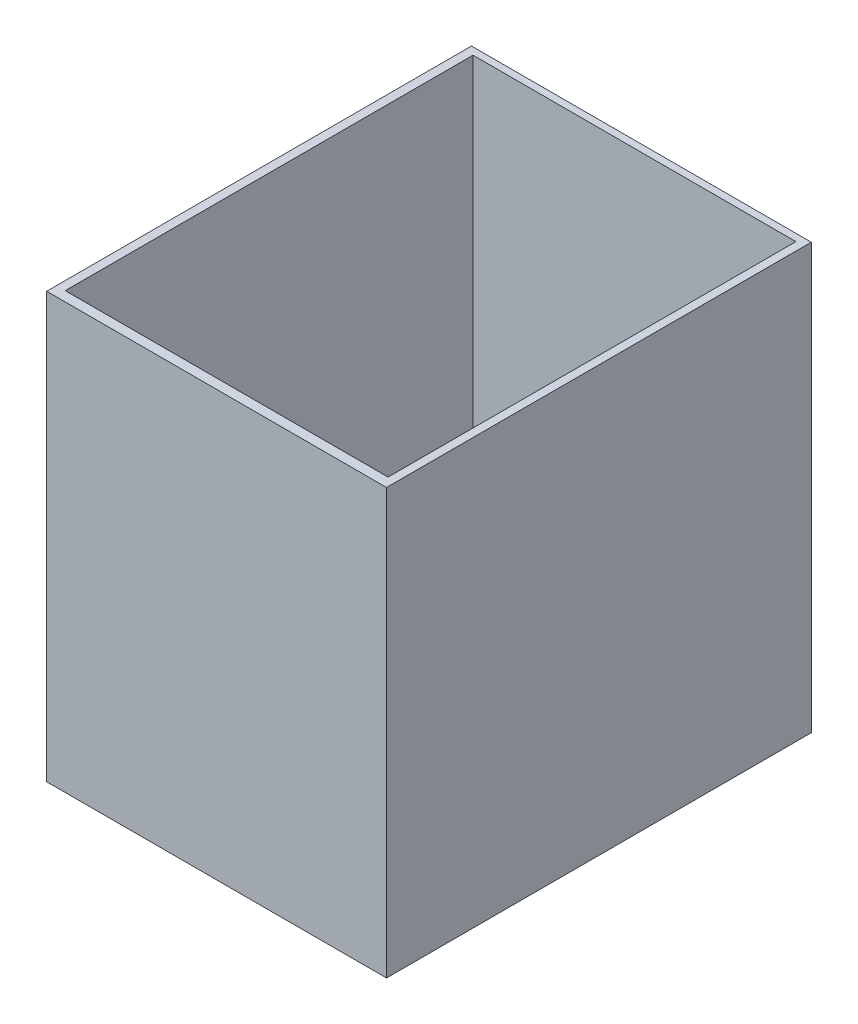
ISO-10303-21;
HEADER;
FILE_DESCRIPTION(('STEP AP214'),'2;1');
FILE_NAME('part.step','',(''),(''),'','','');
FILE_SCHEMA(('AUTOMOTIVE_DESIGN { 1 0 10303 214 1 1 1 1 }'));
ENDSEC;
DATA;
#1=APPLICATION_CONTEXT('core data for automotive mechanical design processes');
#2=APPLICATION_PROTOCOL_DEFINITION('international standard','automotive_design',2000,#1);
#3=PRODUCT_CONTEXT('',#1,'mechanical');
#4=PRODUCT('Part','Part','',(#3));
#5=PRODUCT_RELATED_PRODUCT_CATEGORY('part','',(#4));
#6=PRODUCT_DEFINITION_FORMATION('','',#4);
#7=PRODUCT_DEFINITION_CONTEXT('part definition',#1,'design');
#8=PRODUCT_DEFINITION('design','',#6,#7);
#9=PRODUCT_DEFINITION_SHAPE('','',#8);
#10=(LENGTH_UNIT() NAMED_UNIT(*) SI_UNIT(.MILLI.,.METRE.));
#11=(NAMED_UNIT(*) PLANE_ANGLE_UNIT() SI_UNIT($,.RADIAN.));
#12=(NAMED_UNIT(*) SI_UNIT($,.STERADIAN.) SOLID_ANGLE_UNIT());
#13=UNCERTAINTY_MEASURE_WITH_UNIT(LENGTH_MEASURE(1.E-05),#10,'distance_accuracy_value','');
#14=(GEOMETRIC_REPRESENTATION_CONTEXT(3) GLOBAL_UNCERTAINTY_ASSIGNED_CONTEXT((#13)) GLOBAL_UNIT_ASSIGNED_CONTEXT((#10,
#11,#12)) REPRESENTATION_CONTEXT('',''));
#15=CARTESIAN_POINT('',(0.,0.,0.));
#16=DIRECTION('',(0.,0.,1.));
#17=DIRECTION('',(1.,0.,0.));
#18=AXIS2_PLACEMENT_3D('',#15,#16,#17);
#19=CARTESIAN_POINT('',(-400.,-500.,1000.));
#20=DIRECTION('',(-1.,0.,0.));
#21=DIRECTION('',(0.,0.,1.));
#22=AXIS2_PLACEMENT_3D('',#19,#20,#21);
#23=PLANE('',#22);
#24=DIRECTION('',(0.,1.,0.));
#25=VECTOR('',#24,1.);
#26=CARTESIAN_POINT('',(-400.,-500.,0.));
#27=LINE('',#26,#25);
#28=CARTESIAN_POINT('',(-400.,-500.,0.));
#29=VERTEX_POINT('',#28);
#30=CARTESIAN_POINT('',(-400.,500.,0.));
#31=VERTEX_POINT('',#30);
#32=EDGE_CURVE('E144',#29,#31,#27,.T.);
#33=ORIENTED_EDGE('',*,*,#32,.F.);
#34=DIRECTION('',(0.,0.,-1.));
#35=VECTOR('',#34,1.);
#36=CARTESIAN_POINT('',(-400.,-500.,1000.));
#37=LINE('',#36,#35);
#38=CARTESIAN_POINT('',(-400.,-500.,1000.));
#39=VERTEX_POINT('',#38);
#40=EDGE_CURVE('E11',#39,#29,#37,.T.);
#41=ORIENTED_EDGE('',*,*,#40,.F.);
#42=DIRECTION('',(0.,1.,0.));
#43=VECTOR('',#42,1.);
#44=CARTESIAN_POINT('',(-400.,-500.,1000.));
#45=LINE('',#44,#43);
#46=CARTESIAN_POINT('',(-400.,500.,1000.));
#47=VERTEX_POINT('',#46);
#48=EDGE_CURVE('E146',#39,#47,#45,.T.);
#49=ORIENTED_EDGE('',*,*,#48,.T.);
#50=DIRECTION('',(0.,0.,-1.));
#51=VECTOR('',#50,1.);
#52=CARTESIAN_POINT('',(-400.,500.,1000.));
#53=LINE('',#52,#51);
#54=EDGE_CURVE('E45',#47,#31,#53,.T.);
#55=ORIENTED_EDGE('',*,*,#54,.T.);
#56=EDGE_LOOP('',(#33,#41,#49,#55));
#57=FACE_BOUND('',#56,.T.);
#58=ADVANCED_FACE('F39',(#57),#23,.T.);
#59=CARTESIAN_POINT('',(-400.,-500.,1000.));
#60=DIRECTION('',(0.,1.,0.));
#61=DIRECTION('',(0.,0.,1.));
#62=AXIS2_PLACEMENT_3D('',#59,#60,#61);
#63=PLANE('',#62);
#64=DIRECTION('',(1.,0.,0.));
#65=VECTOR('',#64,1.);
#66=CARTESIAN_POINT('',(-400.,-500.,0.));
#67=LINE('',#66,#65);
#68=CARTESIAN_POINT('',(400.,-500.,0.));
#69=VERTEX_POINT('',#68);
#70=EDGE_CURVE('E155',#29,#69,#67,.T.);
#71=ORIENTED_EDGE('',*,*,#70,.T.);
#72=DIRECTION('',(0.,0.,-1.));
#73=VECTOR('',#72,1.);
#74=CARTESIAN_POINT('',(400.,-500.,1000.));
#75=LINE('',#74,#73);
#76=CARTESIAN_POINT('',(400.,-500.,1000.));
#77=VERTEX_POINT('',#76);
#78=EDGE_CURVE('E50',#77,#69,#75,.T.);
#79=ORIENTED_EDGE('',*,*,#78,.F.);
#80=DIRECTION('',(1.,0.,0.));
#81=VECTOR('',#80,1.);
#82=CARTESIAN_POINT('',(-400.,-500.,1000.));
#83=LINE('',#82,#81);
#84=EDGE_CURVE('E157',#39,#77,#83,.T.);
#85=ORIENTED_EDGE('',*,*,#84,.F.);
#86=ORIENTED_EDGE('',*,*,#40,.T.);
#87=EDGE_LOOP('',(#71,#79,#85,#86));
#88=FACE_BOUND('',#87,.T.);
#89=ADVANCED_FACE('F176',(#88),#63,.F.);
#90=CARTESIAN_POINT('',(400.,-500.,1000.));
#91=DIRECTION('',(-1.,0.,0.));
#92=DIRECTION('',(0.,0.,1.));
#93=AXIS2_PLACEMENT_3D('',#90,#91,#92);
#94=PLANE('',#93);
#95=DIRECTION('',(0.,1.,0.));
#96=VECTOR('',#95,1.);
#97=CARTESIAN_POINT('',(400.,-500.,0.));
#98=LINE('',#97,#96);
#99=CARTESIAN_POINT('',(400.,500.,0.));
#100=VERTEX_POINT('',#99);
#101=EDGE_CURVE('E161',#69,#100,#98,.T.);
#102=ORIENTED_EDGE('',*,*,#101,.T.);
#103=DIRECTION('',(0.,0.,-1.));
#104=VECTOR('',#103,1.);
#105=CARTESIAN_POINT('',(400.,500.,1000.));
#106=LINE('',#105,#104);
#107=CARTESIAN_POINT('',(400.,500.,1000.));
#108=VERTEX_POINT('',#107);
#109=EDGE_CURVE('E166',#108,#100,#106,.T.);
#110=ORIENTED_EDGE('',*,*,#109,.F.);
#111=DIRECTION('',(0.,1.,0.));
#112=VECTOR('',#111,1.);
#113=CARTESIAN_POINT('',(400.,-500.,1000.));
#114=LINE('',#113,#112);
#115=EDGE_CURVE('E152',#77,#108,#114,.T.);
#116=ORIENTED_EDGE('',*,*,#115,.F.);
#117=ORIENTED_EDGE('',*,*,#78,.T.);
#118=EDGE_LOOP('',(#102,#110,#116,#117));
#119=FACE_BOUND('',#118,.T.);
#120=ADVANCED_FACE('F177',(#119),#94,.F.);
#121=CARTESIAN_POINT('',(-400.,500.,1000.));
#122=DIRECTION('',(0.,1.,0.));
#123=DIRECTION('',(0.,0.,1.));
#124=AXIS2_PLACEMENT_3D('',#121,#122,#123);
#125=PLANE('',#124);
#126=DIRECTION('',(0.,0.,1.));
#127=VECTOR('',#126,1.);
#128=CARTESIAN_POINT('',(-379.411649580569,500.,16.9068114060526));
#129=LINE('',#128,#127);
#130=CARTESIAN_POINT('',(-379.411649580569,500.,16.9068114060526));
#131=VERTEX_POINT('',#130);
#132=CARTESIAN_POINT('',(-379.411649580568,500.,976.906811406053));
#133=VERTEX_POINT('',#132);
#134=EDGE_CURVE('E54',#131,#133,#129,.T.);
#135=ORIENTED_EDGE('',*,*,#134,.F.);
#136=DIRECTION('',(-1.,0.,0.));
#137=VECTOR('',#136,1.);
#138=CARTESIAN_POINT('',(-379.411649580569,500.,16.9068114060526));
#139=LINE('',#138,#137);
#140=CARTESIAN_POINT('',(380.588350419431,500.,16.9068114060527));
#141=VERTEX_POINT('',#140);
#142=EDGE_CURVE('E127',#141,#131,#139,.T.);
#143=ORIENTED_EDGE('',*,*,#142,.F.);
#144=DIRECTION('',(0.,0.,-1.));
#145=VECTOR('',#144,1.);
#146=CARTESIAN_POINT('',(380.588350419431,500.,16.9068114060527));
#147=LINE('',#146,#145);
#148=CARTESIAN_POINT('',(380.588350419432,500.,976.906811406053));
#149=VERTEX_POINT('',#148);
#150=EDGE_CURVE('E133',#149,#141,#147,.T.);
#151=ORIENTED_EDGE('',*,*,#150,.F.);
#152=DIRECTION('',(1.,0.,0.));
#153=VECTOR('',#152,1.);
#154=CARTESIAN_POINT('',(-379.411649580568,500.,976.906811406053));
#155=LINE('',#154,#153);
#156=EDGE_CURVE('E137',#133,#149,#155,.T.);
#157=ORIENTED_EDGE('',*,*,#156,.F.);
#158=EDGE_LOOP('',(#135,#143,#151,#157));
#159=FACE_BOUND('',#158,.T.);
#160=DIRECTION('',(1.,0.,0.));
#161=VECTOR('',#160,1.);
#162=CARTESIAN_POINT('',(-400.,500.,0.));
#163=LINE('',#162,#161);
#164=EDGE_CURVE('E158',#31,#100,#163,.T.);
#165=ORIENTED_EDGE('',*,*,#164,.F.);
#166=ORIENTED_EDGE('',*,*,#54,.F.);
#167=DIRECTION('',(1.,0.,0.));
#168=VECTOR('',#167,1.);
#169=CARTESIAN_POINT('',(-400.,500.,1000.));
#170=LINE('',#169,#168);
#171=EDGE_CURVE('E153',#47,#108,#170,.T.);
#172=ORIENTED_EDGE('',*,*,#171,.T.);
#173=ORIENTED_EDGE('',*,*,#109,.T.);
#174=EDGE_LOOP('',(#165,#166,#172,#173));
#175=FACE_BOUND('',#174,.T.);
#176=ADVANCED_FACE('F173',(#159,#175),#125,.T.);
#177=CARTESIAN_POINT('',(0.,0.,1000.));
#178=DIRECTION('',(0.,0.,-1.));
#179=DIRECTION('',(-1.,0.,0.));
#180=AXIS2_PLACEMENT_3D('',#177,#178,#179);
#181=PLANE('',#180);
#182=ORIENTED_EDGE('',*,*,#48,.F.);
#183=ORIENTED_EDGE('',*,*,#84,.T.);
#184=ORIENTED_EDGE('',*,*,#115,.T.);
#185=ORIENTED_EDGE('',*,*,#171,.F.);
#186=EDGE_LOOP('',(#182,#183,#184,#185));
#187=FACE_BOUND('',#186,.T.);
#188=ADVANCED_FACE('F181',(#187),#181,.F.);
#189=CARTESIAN_POINT('',(0.,0.,0.));
#190=DIRECTION('',(0.,0.,-1.));
#191=DIRECTION('',(-1.,0.,0.));
#192=AXIS2_PLACEMENT_3D('',#189,#190,#191);
#193=PLANE('',#192);
#194=ORIENTED_EDGE('',*,*,#32,.T.);
#195=ORIENTED_EDGE('',*,*,#164,.T.);
#196=ORIENTED_EDGE('',*,*,#101,.F.);
#197=ORIENTED_EDGE('',*,*,#70,.F.);
#198=EDGE_LOOP('',(#194,#195,#196,#197));
#199=FACE_BOUND('',#198,.T.);
#200=ADVANCED_FACE('F174',(#199),#193,.T.);
#201=CARTESIAN_POINT('',(-379.411649580569,-460.,16.9068114060526));
#202=DIRECTION('',(-1.,0.,0.));
#203=DIRECTION('',(0.,0.,1.));
#204=AXIS2_PLACEMENT_3D('',#201,#202,#203);
#205=PLANE('',#204);
#206=ORIENTED_EDGE('',*,*,#134,.T.);
#207=DIRECTION('',(0.,1.,0.));
#208=VECTOR('',#207,1.);
#209=CARTESIAN_POINT('',(-379.411649580568,-460.,976.906811406053));
#210=LINE('',#209,#208);
#211=CARTESIAN_POINT('',(-379.411649580568,-460.,976.906811406053));
#212=VERTEX_POINT('',#211);
#213=EDGE_CURVE('E106',#212,#133,#210,.T.);
#214=ORIENTED_EDGE('',*,*,#213,.F.);
#215=DIRECTION('',(0.,0.,1.));
#216=VECTOR('',#215,1.);
#217=CARTESIAN_POINT('',(-379.411649580569,-460.,16.9068114060526));
#218=LINE('',#217,#216);
#219=CARTESIAN_POINT('',(-379.411649580569,-460.,16.9068114060526));
#220=VERTEX_POINT('',#219);
#221=EDGE_CURVE('E115',#220,#212,#218,.T.);
#222=ORIENTED_EDGE('',*,*,#221,.F.);
#223=DIRECTION('',(0.,1.,0.));
#224=VECTOR('',#223,1.);
#225=CARTESIAN_POINT('',(-379.411649580569,-460.,16.9068114060526));
#226=LINE('',#225,#224);
#227=EDGE_CURVE('E142',#220,#131,#226,.T.);
#228=ORIENTED_EDGE('',*,*,#227,.T.);
#229=EDGE_LOOP('',(#206,#214,#222,#228));
#230=FACE_BOUND('',#229,.T.);
#231=ADVANCED_FACE('F109',(#230),#205,.F.);
#232=CARTESIAN_POINT('',(-379.411649580569,-460.,16.9068114060526));
#233=DIRECTION('',(0.,0.,-1.));
#234=DIRECTION('',(-1.,0.,0.));
#235=AXIS2_PLACEMENT_3D('',#232,#233,#234);
#236=PLANE('',#235);
#237=ORIENTED_EDGE('',*,*,#142,.T.);
#238=ORIENTED_EDGE('',*,*,#227,.F.);
#239=DIRECTION('',(-1.,0.,0.));
#240=VECTOR('',#239,1.);
#241=CARTESIAN_POINT('',(-379.411649580569,-460.,16.9068114060526));
#242=LINE('',#241,#240);
#243=CARTESIAN_POINT('',(380.588350419431,-460.,16.9068114060527));
#244=VERTEX_POINT('',#243);
#245=EDGE_CURVE('E116',#244,#220,#242,.T.);
#246=ORIENTED_EDGE('',*,*,#245,.F.);
#247=DIRECTION('',(0.,1.,0.));
#248=VECTOR('',#247,1.);
#249=CARTESIAN_POINT('',(380.588350419431,-460.,16.9068114060527));
#250=LINE('',#249,#248);
#251=EDGE_CURVE('E147',#244,#141,#250,.T.);
#252=ORIENTED_EDGE('',*,*,#251,.T.);
#253=EDGE_LOOP('',(#237,#238,#246,#252));
#254=FACE_BOUND('',#253,.T.);
#255=ADVANCED_FACE('F231',(#254),#236,.F.);
#256=CARTESIAN_POINT('',(380.588350419431,-460.,16.9068114060527));
#257=DIRECTION('',(1.,0.,0.));
#258=DIRECTION('',(0.,0.,-1.));
#259=AXIS2_PLACEMENT_3D('',#256,#257,#258);
#260=PLANE('',#259);
#261=ORIENTED_EDGE('',*,*,#150,.T.);
#262=ORIENTED_EDGE('',*,*,#251,.F.);
#263=DIRECTION('',(0.,0.,-1.));
#264=VECTOR('',#263,1.);
#265=CARTESIAN_POINT('',(380.588350419431,-460.,16.9068114060527));
#266=LINE('',#265,#264);
#267=CARTESIAN_POINT('',(380.588350419432,-460.,976.906811406053));
#268=VERTEX_POINT('',#267);
#269=EDGE_CURVE('E128',#268,#244,#266,.T.);
#270=ORIENTED_EDGE('',*,*,#269,.F.);
#271=DIRECTION('',(0.,1.,0.));
#272=VECTOR('',#271,1.);
#273=CARTESIAN_POINT('',(380.588350419432,-460.,976.906811406053));
#274=LINE('',#273,#272);
#275=EDGE_CURVE('E120',#268,#149,#274,.T.);
#276=ORIENTED_EDGE('',*,*,#275,.T.);
#277=EDGE_LOOP('',(#261,#262,#270,#276));
#278=FACE_BOUND('',#277,.T.);
#279=ADVANCED_FACE('F236',(#278),#260,.F.);
#280=CARTESIAN_POINT('',(-379.411649580568,-460.,976.906811406053));
#281=DIRECTION('',(0.,0.,1.));
#282=DIRECTION('',(1.,0.,0.));
#283=AXIS2_PLACEMENT_3D('',#280,#281,#282);
#284=PLANE('',#283);
#285=ORIENTED_EDGE('',*,*,#156,.T.);
#286=ORIENTED_EDGE('',*,*,#275,.F.);
#287=DIRECTION('',(1.,0.,0.));
#288=VECTOR('',#287,1.);
#289=CARTESIAN_POINT('',(-379.411649580568,-460.,976.906811406053));
#290=LINE('',#289,#288);
#291=EDGE_CURVE('E123',#212,#268,#290,.T.);
#292=ORIENTED_EDGE('',*,*,#291,.F.);
#293=ORIENTED_EDGE('',*,*,#213,.T.);
#294=EDGE_LOOP('',(#285,#286,#292,#293));
#295=FACE_BOUND('',#294,.T.);
#296=ADVANCED_FACE('F122',(#295),#284,.F.);
#297=CARTESIAN_POINT('',(0.,-460.,0.));
#298=DIRECTION('',(0.,1.,0.));
#299=DIRECTION('',(0.,0.,1.));
#300=AXIS2_PLACEMENT_3D('',#297,#298,#299);
#301=PLANE('',#300);
#302=ORIENTED_EDGE('',*,*,#221,.T.);
#303=ORIENTED_EDGE('',*,*,#291,.T.);
#304=ORIENTED_EDGE('',*,*,#269,.T.);
#305=ORIENTED_EDGE('',*,*,#245,.T.);
#306=EDGE_LOOP('',(#302,#303,#304,#305));
#307=FACE_BOUND('',#306,.T.);
#308=ADVANCED_FACE('F126',(#307),#301,.T.);
#309=CLOSED_SHELL('',(#58,#89,#120,#176,#188,#200,#231,#255,#279,#296,#308));
#310=MANIFOLD_SOLID_BREP('B2',#309);
#311=ADVANCED_BREP_SHAPE_REPRESENTATION('',(#18,#310),#14);
#312=SHAPE_DEFINITION_REPRESENTATION(#9,#311);
ENDSEC;
END-ISO-10303-21;
